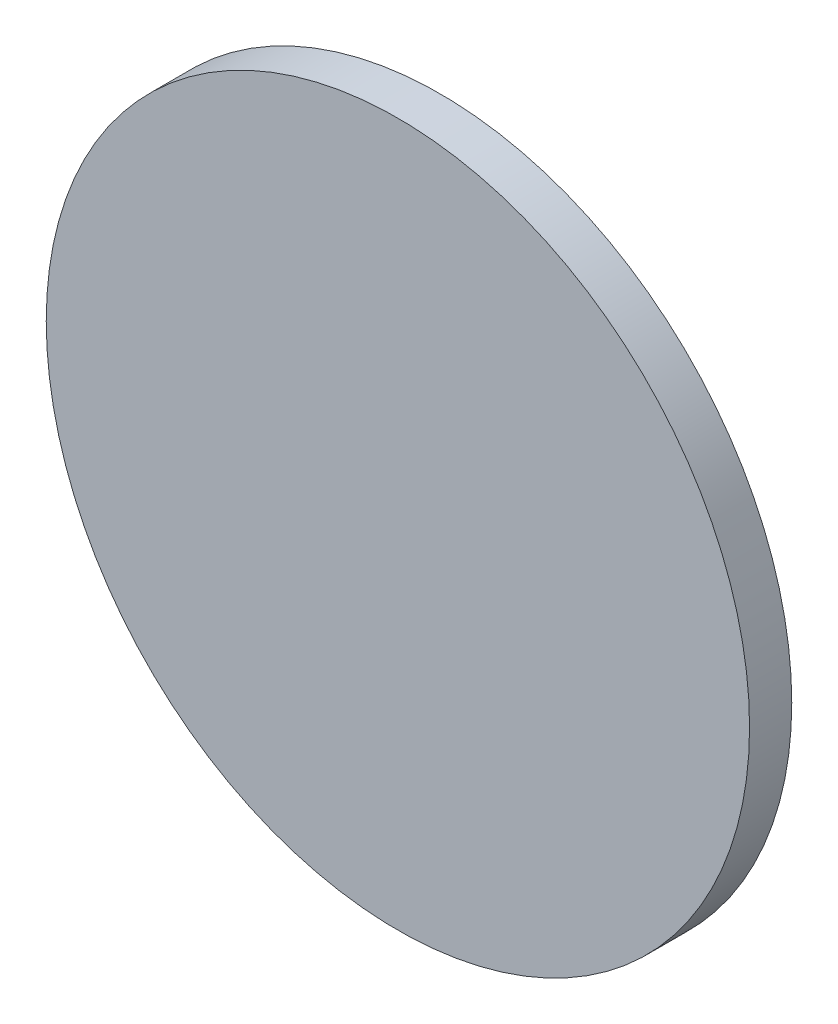
ISO-10303-21;
HEADER;
FILE_DESCRIPTION(('STEP AP214'),'2;1');
FILE_NAME('part.step','',(''),(''),'','','');
FILE_SCHEMA(('AUTOMOTIVE_DESIGN { 1 0 10303 214 1 1 1 1 }'));
ENDSEC;
DATA;
#1=APPLICATION_CONTEXT('core data for automotive mechanical design processes');
#2=APPLICATION_PROTOCOL_DEFINITION('international standard','automotive_design',2000,#1);
#3=PRODUCT_CONTEXT('',#1,'mechanical');
#4=PRODUCT('Part','Part','',(#3));
#5=PRODUCT_RELATED_PRODUCT_CATEGORY('part','',(#4));
#6=PRODUCT_DEFINITION_FORMATION('','',#4);
#7=PRODUCT_DEFINITION_CONTEXT('part definition',#1,'design');
#8=PRODUCT_DEFINITION('design','',#6,#7);
#9=PRODUCT_DEFINITION_SHAPE('','',#8);
#10=(LENGTH_UNIT() NAMED_UNIT(*) SI_UNIT(.MILLI.,.METRE.));
#11=(NAMED_UNIT(*) PLANE_ANGLE_UNIT() SI_UNIT($,.RADIAN.));
#12=(NAMED_UNIT(*) SI_UNIT($,.STERADIAN.) SOLID_ANGLE_UNIT());
#13=UNCERTAINTY_MEASURE_WITH_UNIT(LENGTH_MEASURE(1.E-05),#10,'distance_accuracy_value','');
#14=(GEOMETRIC_REPRESENTATION_CONTEXT(3) GLOBAL_UNCERTAINTY_ASSIGNED_CONTEXT((#13)) GLOBAL_UNIT_ASSIGNED_CONTEXT((#10,
#11,#12)) REPRESENTATION_CONTEXT('',''));
#15=CARTESIAN_POINT('',(0.,0.,0.));
#16=DIRECTION('',(0.,0.,1.));
#17=DIRECTION('',(1.,0.,0.));
#18=AXIS2_PLACEMENT_3D('',#15,#16,#17);
#19=CARTESIAN_POINT('',(0.,0.,0.6));
#20=DIRECTION('',(0.,0.,-1.));
#21=DIRECTION('',(-1.,0.,0.));
#22=AXIS2_PLACEMENT_3D('',#19,#20,#21);
#23=CYLINDRICAL_SURFACE('',#22,5.);
#24=CARTESIAN_POINT('',(0.,0.,0.6));
#25=DIRECTION('',(0.,0.,1.));
#26=DIRECTION('',(1.,0.,0.));
#27=AXIS2_PLACEMENT_3D('',#24,#25,#26);
#28=CIRCLE('',#27,5.);
#29=CARTESIAN_POINT('',(5.,0.,0.6));
#30=VERTEX_POINT('',#29);
#31=EDGE_CURVE('E10',#30,#30,#28,.T.);
#32=ORIENTED_EDGE('',*,*,#31,.F.);
#33=EDGE_LOOP('',(#32));
#34=FACE_BOUND('',#33,.T.);
#35=CARTESIAN_POINT('',(0.,0.,0.));
#36=DIRECTION('',(0.,0.,1.));
#37=DIRECTION('',(1.,0.,0.));
#38=AXIS2_PLACEMENT_3D('',#35,#36,#37);
#39=CIRCLE('',#38,5.);
#40=CARTESIAN_POINT('',(5.,0.,0.));
#41=VERTEX_POINT('',#40);
#42=EDGE_CURVE('E34',#41,#41,#39,.T.);
#43=ORIENTED_EDGE('',*,*,#42,.T.);
#44=EDGE_LOOP('',(#43));
#45=FACE_BOUND('',#44,.T.);
#46=ADVANCED_FACE('F31',(#34,#45),#23,.T.);
#47=CARTESIAN_POINT('',(0.,0.,0.6));
#48=DIRECTION('',(0.,0.,1.));
#49=DIRECTION('',(1.,0.,0.));
#50=AXIS2_PLACEMENT_3D('',#47,#48,#49);
#51=PLANE('',#50);
#52=ORIENTED_EDGE('',*,*,#31,.T.);
#53=EDGE_LOOP('',(#52));
#54=FACE_BOUND('',#53,.T.);
#55=ADVANCED_FACE('F46',(#54),#51,.T.);
#56=CARTESIAN_POINT('',(0.,0.,0.));
#57=DIRECTION('',(0.,0.,1.));
#58=DIRECTION('',(1.,0.,0.));
#59=AXIS2_PLACEMENT_3D('',#56,#57,#58);
#60=PLANE('',#59);
#61=ORIENTED_EDGE('',*,*,#42,.F.);
#62=EDGE_LOOP('',(#61));
#63=FACE_BOUND('',#62,.T.);
#64=ADVANCED_FACE('F44',(#63),#60,.F.);
#65=CLOSED_SHELL('',(#46,#55,#64));
#66=MANIFOLD_SOLID_BREP('B2',#65);
#67=ADVANCED_BREP_SHAPE_REPRESENTATION('',(#18,#66),#14);
#68=SHAPE_DEFINITION_REPRESENTATION(#9,#67);
ENDSEC;
END-ISO-10303-21;
